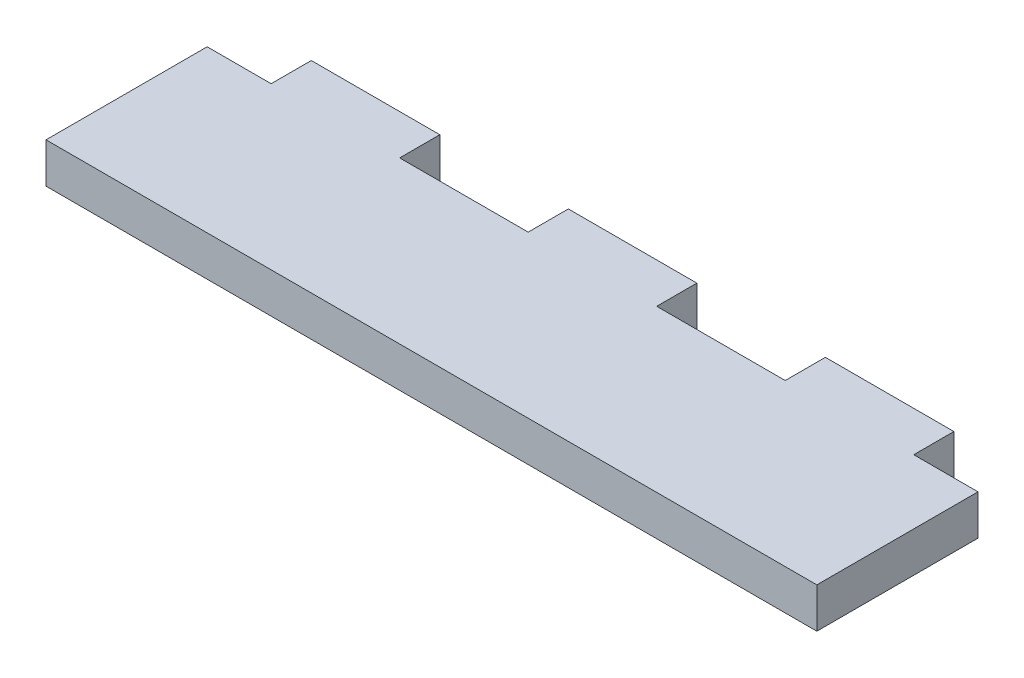
ISO-10303-21;
HEADER;
FILE_DESCRIPTION(('STEP AP214'),'2;1');
FILE_NAME('part.step','',(''),(''),'','','');
FILE_SCHEMA(('AUTOMOTIVE_DESIGN { 1 0 10303 214 1 1 1 1 }'));
ENDSEC;
DATA;
#1=APPLICATION_CONTEXT('core data for automotive mechanical design processes');
#2=APPLICATION_PROTOCOL_DEFINITION('international standard','automotive_design',2000,#1);
#3=PRODUCT_CONTEXT('',#1,'mechanical');
#4=PRODUCT('Part','Part','',(#3));
#5=PRODUCT_RELATED_PRODUCT_CATEGORY('part','',(#4));
#6=PRODUCT_DEFINITION_FORMATION('','',#4);
#7=PRODUCT_DEFINITION_CONTEXT('part definition',#1,'design');
#8=PRODUCT_DEFINITION('design','',#6,#7);
#9=PRODUCT_DEFINITION_SHAPE('','',#8);
#10=(LENGTH_UNIT() NAMED_UNIT(*) SI_UNIT(.MILLI.,.METRE.));
#11=(NAMED_UNIT(*) PLANE_ANGLE_UNIT() SI_UNIT($,.RADIAN.));
#12=(NAMED_UNIT(*) SI_UNIT($,.STERADIAN.) SOLID_ANGLE_UNIT());
#13=UNCERTAINTY_MEASURE_WITH_UNIT(LENGTH_MEASURE(1.E-05),#10,'distance_accuracy_value','');
#14=(GEOMETRIC_REPRESENTATION_CONTEXT(3) GLOBAL_UNCERTAINTY_ASSIGNED_CONTEXT((#13)) GLOBAL_UNIT_ASSIGNED_CONTEXT((#10,
#11,#12)) REPRESENTATION_CONTEXT('',''));
#15=CARTESIAN_POINT('',(0.,0.,0.));
#16=DIRECTION('',(0.,0.,1.));
#17=DIRECTION('',(1.,0.,0.));
#18=AXIS2_PLACEMENT_3D('',#15,#16,#17);
#19=CARTESIAN_POINT('',(0.,3.175,-41.275));
#20=DIRECTION('',(0.,0.,1.));
#21=DIRECTION('',(1.,0.,0.));
#22=AXIS2_PLACEMENT_3D('',#19,#20,#21);
#23=PLANE('',#22);
#24=DIRECTION('',(-1.,0.,0.));
#25=VECTOR('',#24,1.);
#26=CARTESIAN_POINT('',(0.,3.175,-41.275));
#27=LINE('',#26,#25);
#28=CARTESIAN_POINT('',(73.66,3.175,-41.275));
#29=VERTEX_POINT('',#28);
#30=CARTESIAN_POINT('',(68.5799999999997,3.175,-41.275));
#31=VERTEX_POINT('',#30);
#32=EDGE_CURVE('E365',#29,#31,#27,.T.);
#33=ORIENTED_EDGE('',*,*,#32,.F.);
#34=DIRECTION('',(0.,1.,0.));
#35=VECTOR('',#34,1.);
#36=CARTESIAN_POINT('',(73.66,0.,-41.275));
#37=LINE('',#36,#35);
#38=CARTESIAN_POINT('',(73.66,0.,-41.275));
#39=VERTEX_POINT('',#38);
#40=EDGE_CURVE('E244',#39,#29,#37,.T.);
#41=ORIENTED_EDGE('',*,*,#40,.F.);
#42=DIRECTION('',(-1.,0.,0.));
#43=VECTOR('',#42,1.);
#44=CARTESIAN_POINT('',(0.,0.,-41.275));
#45=LINE('',#44,#43);
#46=CARTESIAN_POINT('',(68.5799999999997,0.,-41.275));
#47=VERTEX_POINT('',#46);
#48=EDGE_CURVE('E378',#39,#47,#45,.T.);
#49=ORIENTED_EDGE('',*,*,#48,.T.);
#50=DIRECTION('',(0.,1.,0.));
#51=VECTOR('',#50,1.);
#52=CARTESIAN_POINT('',(68.5799999999997,3.175,-41.275));
#53=LINE('',#52,#51);
#54=EDGE_CURVE('E404',#47,#31,#53,.T.);
#55=ORIENTED_EDGE('',*,*,#54,.T.);
#56=EDGE_LOOP('',(#33,#41,#49,#55));
#57=FACE_BOUND('',#56,.T.);
#58=ADVANCED_FACE('F222',(#57),#23,.F.);
#59=CARTESIAN_POINT('',(58.4199999999997,3.175,-41.275));
#60=VERTEX_POINT('',#59);
#61=CARTESIAN_POINT('',(48.2599999999997,3.175,-41.275));
#62=VERTEX_POINT('',#61);
#63=EDGE_CURVE('E368',#60,#62,#27,.T.);
#64=ORIENTED_EDGE('',*,*,#63,.F.);
#65=DIRECTION('',(0.,-1.,0.));
#66=VECTOR('',#65,1.);
#67=CARTESIAN_POINT('',(58.4199999999997,3.175,-41.2750000000004));
#68=LINE('',#67,#66);
#69=CARTESIAN_POINT('',(58.4199999999997,0.,-41.275));
#70=VERTEX_POINT('',#69);
#71=EDGE_CURVE('E230',#60,#70,#68,.T.);
#72=ORIENTED_EDGE('',*,*,#71,.T.);
#73=CARTESIAN_POINT('',(48.2599999999997,0.,-41.275));
#74=VERTEX_POINT('',#73);
#75=EDGE_CURVE('E381',#70,#74,#45,.T.);
#76=ORIENTED_EDGE('',*,*,#75,.T.);
#77=DIRECTION('',(0.,1.,0.));
#78=VECTOR('',#77,1.);
#79=CARTESIAN_POINT('',(48.2599999999997,3.175,-41.275));
#80=LINE('',#79,#78);
#81=EDGE_CURVE('E401',#74,#62,#80,.T.);
#82=ORIENTED_EDGE('',*,*,#81,.T.);
#83=EDGE_LOOP('',(#64,#72,#76,#82));
#84=FACE_BOUND('',#83,.T.);
#85=ADVANCED_FACE('F491',(#84),#23,.F.);
#86=CARTESIAN_POINT('',(38.0999999999997,3.175,-41.275));
#87=VERTEX_POINT('',#86);
#88=CARTESIAN_POINT('',(27.9399999999997,3.175,-41.275));
#89=VERTEX_POINT('',#88);
#90=EDGE_CURVE('E369',#87,#89,#27,.T.);
#91=ORIENTED_EDGE('',*,*,#90,.F.);
#92=DIRECTION('',(0.,-1.,0.));
#93=VECTOR('',#92,1.);
#94=CARTESIAN_POINT('',(38.0999999999997,3.175,-41.275));
#95=LINE('',#94,#93);
#96=CARTESIAN_POINT('',(38.0999999999997,0.,-41.275));
#97=VERTEX_POINT('',#96);
#98=EDGE_CURVE('E403',#87,#97,#95,.T.);
#99=ORIENTED_EDGE('',*,*,#98,.T.);
#100=CARTESIAN_POINT('',(27.9399999999997,0.,-41.275));
#101=VERTEX_POINT('',#100);
#102=EDGE_CURVE('E382',#97,#101,#45,.T.);
#103=ORIENTED_EDGE('',*,*,#102,.T.);
#104=DIRECTION('',(0.,-1.,0.));
#105=VECTOR('',#104,1.);
#106=CARTESIAN_POINT('',(27.9399999999997,3.175,-41.275));
#107=LINE('',#106,#105);
#108=EDGE_CURVE('E398',#89,#101,#107,.T.);
#109=ORIENTED_EDGE('',*,*,#108,.F.);
#110=EDGE_LOOP('',(#91,#99,#103,#109));
#111=FACE_BOUND('',#110,.T.);
#112=ADVANCED_FACE('F452',(#111),#23,.F.);
#113=CARTESIAN_POINT('',(27.9399999999997,3.175,0.));
#114=DIRECTION('',(1.,0.,0.));
#115=DIRECTION('',(0.,0.,-1.));
#116=AXIS2_PLACEMENT_3D('',#113,#114,#115);
#117=PLANE('',#116);
#118=DIRECTION('',(0.,0.,1.));
#119=VECTOR('',#118,1.);
#120=CARTESIAN_POINT('',(27.9399999999997,0.,0.));
#121=LINE('',#120,#119);
#122=CARTESIAN_POINT('',(27.9399999999997,0.,-44.4499999999996));
#123=VERTEX_POINT('',#122);
#124=EDGE_CURVE('E380',#123,#101,#121,.T.);
#125=ORIENTED_EDGE('',*,*,#124,.F.);
#126=DIRECTION('',(0.,-1.,0.));
#127=VECTOR('',#126,1.);
#128=CARTESIAN_POINT('',(27.9399999999997,3.175,-44.4499999999996));
#129=LINE('',#128,#127);
#130=CARTESIAN_POINT('',(27.9399999999997,3.175,-44.4499999999996));
#131=VERTEX_POINT('',#130);
#132=EDGE_CURVE('E396',#131,#123,#129,.T.);
#133=ORIENTED_EDGE('',*,*,#132,.F.);
#134=DIRECTION('',(0.,0.,1.));
#135=VECTOR('',#134,1.);
#136=CARTESIAN_POINT('',(27.9399999999997,3.175,0.));
#137=LINE('',#136,#135);
#138=EDGE_CURVE('E367',#131,#89,#137,.T.);
#139=ORIENTED_EDGE('',*,*,#138,.T.);
#140=ORIENTED_EDGE('',*,*,#108,.T.);
#141=EDGE_LOOP('',(#125,#133,#139,#140));
#142=FACE_BOUND('',#141,.T.);
#143=ADVANCED_FACE('F482',(#142),#117,.T.);
#144=CARTESIAN_POINT('',(0.,3.175,-44.4499999999996));
#145=DIRECTION('',(0.,0.,-1.));
#146=DIRECTION('',(-1.,0.,0.));
#147=AXIS2_PLACEMENT_3D('',#144,#145,#146);
#148=PLANE('',#147);
#149=DIRECTION('',(1.,0.,0.));
#150=VECTOR('',#149,1.);
#151=CARTESIAN_POINT('',(0.,0.,-44.4499999999996));
#152=LINE('',#151,#150);
#153=CARTESIAN_POINT('',(17.7799999999997,0.,-44.4499999999996));
#154=VERTEX_POINT('',#153);
#155=EDGE_CURVE('E386',#154,#123,#152,.T.);
#156=ORIENTED_EDGE('',*,*,#155,.F.);
#157=DIRECTION('',(0.,-1.,0.));
#158=VECTOR('',#157,1.);
#159=CARTESIAN_POINT('',(17.7799999999997,3.175,-44.4499999999996));
#160=LINE('',#159,#158);
#161=CARTESIAN_POINT('',(17.7799999999997,3.175,-44.4499999999996));
#162=VERTEX_POINT('',#161);
#163=EDGE_CURVE('E394',#162,#154,#160,.T.);
#164=ORIENTED_EDGE('',*,*,#163,.F.);
#165=DIRECTION('',(1.,0.,0.));
#166=VECTOR('',#165,1.);
#167=CARTESIAN_POINT('',(0.,3.175,-44.4499999999996));
#168=LINE('',#167,#166);
#169=EDGE_CURVE('E373',#162,#131,#168,.T.);
#170=ORIENTED_EDGE('',*,*,#169,.T.);
#171=ORIENTED_EDGE('',*,*,#132,.T.);
#172=EDGE_LOOP('',(#156,#164,#170,#171));
#173=FACE_BOUND('',#172,.T.);
#174=ADVANCED_FACE('F480',(#173),#148,.T.);
#175=CARTESIAN_POINT('',(17.7799999999997,3.175,0.));
#176=DIRECTION('',(1.,0.,0.));
#177=DIRECTION('',(0.,0.,-1.));
#178=AXIS2_PLACEMENT_3D('',#175,#176,#177);
#179=PLANE('',#178);
#180=DIRECTION('',(0.,0.,1.));
#181=VECTOR('',#180,1.);
#182=CARTESIAN_POINT('',(17.7799999999997,0.,0.));
#183=LINE('',#182,#181);
#184=CARTESIAN_POINT('',(17.7799999999997,0.,-41.275));
#185=VERTEX_POINT('',#184);
#186=EDGE_CURVE('E389',#154,#185,#183,.T.);
#187=ORIENTED_EDGE('',*,*,#186,.T.);
#188=DIRECTION('',(0.,-1.,0.));
#189=VECTOR('',#188,1.);
#190=CARTESIAN_POINT('',(17.7799999999997,3.175,-41.275));
#191=LINE('',#190,#189);
#192=CARTESIAN_POINT('',(17.7799999999997,3.175,-41.275));
#193=VERTEX_POINT('',#192);
#194=EDGE_CURVE('E391',#193,#185,#191,.T.);
#195=ORIENTED_EDGE('',*,*,#194,.F.);
#196=DIRECTION('',(0.,0.,1.));
#197=VECTOR('',#196,1.);
#198=CARTESIAN_POINT('',(17.7799999999997,3.175,0.));
#199=LINE('',#198,#197);
#200=EDGE_CURVE('E376',#162,#193,#199,.T.);
#201=ORIENTED_EDGE('',*,*,#200,.F.);
#202=ORIENTED_EDGE('',*,*,#163,.T.);
#203=EDGE_LOOP('',(#187,#195,#201,#202));
#204=FACE_BOUND('',#203,.T.);
#205=ADVANCED_FACE('F489',(#204),#179,.F.);
#206=CARTESIAN_POINT('',(12.7224399567609,0.,-41.275));
#207=VERTEX_POINT('',#206);
#208=EDGE_CURVE('E383',#185,#207,#45,.T.);
#209=ORIENTED_EDGE('',*,*,#208,.T.);
#210=DIRECTION('',(0.,1.,0.));
#211=VECTOR('',#210,1.);
#212=CARTESIAN_POINT('',(12.7224399567609,3.175,-41.275));
#213=LINE('',#212,#211);
#214=CARTESIAN_POINT('',(12.7224399567609,3.175,-41.275));
#215=VERTEX_POINT('',#214);
#216=EDGE_CURVE('E340',#207,#215,#213,.T.);
#217=ORIENTED_EDGE('',*,*,#216,.T.);
#218=EDGE_CURVE('E370',#193,#215,#27,.T.);
#219=ORIENTED_EDGE('',*,*,#218,.F.);
#220=ORIENTED_EDGE('',*,*,#194,.T.);
#221=EDGE_LOOP('',(#209,#217,#219,#220));
#222=FACE_BOUND('',#221,.T.);
#223=ADVANCED_FACE('F475',(#222),#23,.F.);
#224=CARTESIAN_POINT('',(0.,0.,0.));
#225=DIRECTION('',(0.,1.,0.));
#226=DIRECTION('',(0.,0.,1.));
#227=AXIS2_PLACEMENT_3D('',#224,#225,#226);
#228=PLANE('',#227);
#229=DIRECTION('',(-1.,0.,0.));
#230=VECTOR('',#229,1.);
#231=CARTESIAN_POINT('',(12.7224399567609,0.,-28.5343203418336));
#232=LINE('',#231,#230);
#233=CARTESIAN_POINT('',(73.66,0.,-28.5343203418336));
#234=VERTEX_POINT('',#233);
#235=CARTESIAN_POINT('',(12.7224399567609,0.,-28.5343203418336));
#236=VERTEX_POINT('',#235);
#237=EDGE_CURVE('E237',#234,#236,#232,.T.);
#238=ORIENTED_EDGE('',*,*,#237,.T.);
#239=DIRECTION('',(0.,0.,-1.));
#240=VECTOR('',#239,1.);
#241=CARTESIAN_POINT('',(12.7224399567609,0.,-54.0070991574737));
#242=LINE('',#241,#240);
#243=EDGE_CURVE('E341',#236,#207,#242,.T.);
#244=ORIENTED_EDGE('',*,*,#243,.T.);
#245=ORIENTED_EDGE('',*,*,#208,.F.);
#246=ORIENTED_EDGE('',*,*,#186,.F.);
#247=ORIENTED_EDGE('',*,*,#155,.T.);
#248=ORIENTED_EDGE('',*,*,#124,.T.);
#249=ORIENTED_EDGE('',*,*,#102,.F.);
#250=DIRECTION('',(0.,0.,1.));
#251=VECTOR('',#250,1.);
#252=CARTESIAN_POINT('',(38.0999999999997,0.,-44.45));
#253=LINE('',#252,#251);
#254=CARTESIAN_POINT('',(38.0999999999997,0.,-44.45));
#255=VERTEX_POINT('',#254);
#256=EDGE_CURVE('E364',#255,#97,#253,.T.);
#257=ORIENTED_EDGE('',*,*,#256,.F.);
#258=DIRECTION('',(1.,0.,0.));
#259=VECTOR('',#258,1.);
#260=CARTESIAN_POINT('',(38.0999999999997,0.,-44.45));
#261=LINE('',#260,#259);
#262=CARTESIAN_POINT('',(48.2599999999997,0.,-44.45));
#263=VERTEX_POINT('',#262);
#264=EDGE_CURVE('E435',#255,#263,#261,.T.);
#265=ORIENTED_EDGE('',*,*,#264,.T.);
#266=DIRECTION('',(0.,0.,1.));
#267=VECTOR('',#266,1.);
#268=CARTESIAN_POINT('',(48.2599999999997,0.,-44.45));
#269=LINE('',#268,#267);
#270=EDGE_CURVE('E444',#263,#74,#269,.T.);
#271=ORIENTED_EDGE('',*,*,#270,.T.);
#272=ORIENTED_EDGE('',*,*,#75,.F.);
#273=DIRECTION('',(0.,0.,1.));
#274=VECTOR('',#273,1.);
#275=CARTESIAN_POINT('',(58.4199999999997,0.,-44.4500000000004));
#276=LINE('',#275,#274);
#277=CARTESIAN_POINT('',(58.4199999999997,0.,-44.4500000000004));
#278=VERTEX_POINT('',#277);
#279=EDGE_CURVE('E418',#278,#70,#276,.T.);
#280=ORIENTED_EDGE('',*,*,#279,.F.);
#281=DIRECTION('',(1.,0.,0.));
#282=VECTOR('',#281,1.);
#283=CARTESIAN_POINT('',(58.4199999999997,0.,-44.4500000000004));
#284=LINE('',#283,#282);
#285=CARTESIAN_POINT('',(68.5799999999997,0.,-44.4500000000004));
#286=VERTEX_POINT('',#285);
#287=EDGE_CURVE('E411',#278,#286,#284,.T.);
#288=ORIENTED_EDGE('',*,*,#287,.T.);
#289=DIRECTION('',(0.,0.,1.));
#290=VECTOR('',#289,1.);
#291=CARTESIAN_POINT('',(68.5799999999997,0.,-44.4500000000004));
#292=LINE('',#291,#290);
#293=EDGE_CURVE('E421',#286,#47,#292,.T.);
#294=ORIENTED_EDGE('',*,*,#293,.T.);
#295=ORIENTED_EDGE('',*,*,#48,.F.);
#296=DIRECTION('',(0.,0.,1.));
#297=VECTOR('',#296,1.);
#298=CARTESIAN_POINT('',(73.66,0.,-41.275));
#299=LINE('',#298,#297);
#300=EDGE_CURVE('E353',#39,#234,#299,.T.);
#301=ORIENTED_EDGE('',*,*,#300,.T.);
#302=EDGE_LOOP('',(#238,#244,#245,#246,#247,#248,#249,#257,#265,#271,#272,#280,#288,#294,#295,#301));
#303=FACE_BOUND('',#302,.T.);
#304=ADVANCED_FACE('F351',(#303),#228,.F.);
#305=CARTESIAN_POINT('',(0.,3.175,0.));
#306=DIRECTION('',(0.,1.,0.));
#307=DIRECTION('',(0.,0.,1.));
#308=AXIS2_PLACEMENT_3D('',#305,#306,#307);
#309=PLANE('',#308);
#310=DIRECTION('',(0.,0.,-1.));
#311=VECTOR('',#310,1.);
#312=CARTESIAN_POINT('',(12.7224399567609,3.175,-54.0070991574737));
#313=LINE('',#312,#311);
#314=CARTESIAN_POINT('',(12.7224399567609,3.175,-28.5343203418336));
#315=VERTEX_POINT('',#314);
#316=EDGE_CURVE('E354',#315,#215,#313,.T.);
#317=ORIENTED_EDGE('',*,*,#316,.F.);
#318=DIRECTION('',(-1.,0.,0.));
#319=VECTOR('',#318,1.);
#320=CARTESIAN_POINT('',(12.7224399567609,3.175,-28.5343203418336));
#321=LINE('',#320,#319);
#322=CARTESIAN_POINT('',(73.66,3.175,-28.5343203418336));
#323=VERTEX_POINT('',#322);
#324=EDGE_CURVE('E337',#323,#315,#321,.T.);
#325=ORIENTED_EDGE('',*,*,#324,.F.);
#326=DIRECTION('',(0.,0.,1.));
#327=VECTOR('',#326,1.);
#328=CARTESIAN_POINT('',(73.66,3.175,-41.275));
#329=LINE('',#328,#327);
#330=EDGE_CURVE('E360',#29,#323,#329,.T.);
#331=ORIENTED_EDGE('',*,*,#330,.F.);
#332=ORIENTED_EDGE('',*,*,#32,.T.);
#333=DIRECTION('',(0.,0.,1.));
#334=VECTOR('',#333,1.);
#335=CARTESIAN_POINT('',(68.5799999999997,3.175,-44.4500000000004));
#336=LINE('',#335,#334);
#337=CARTESIAN_POINT('',(68.5799999999997,3.175,-44.4500000000004));
#338=VERTEX_POINT('',#337);
#339=EDGE_CURVE('E410',#338,#31,#336,.T.);
#340=ORIENTED_EDGE('',*,*,#339,.F.);
#341=DIRECTION('',(1.,0.,0.));
#342=VECTOR('',#341,1.);
#343=CARTESIAN_POINT('',(58.4199999999997,3.175,-44.4500000000004));
#344=LINE('',#343,#342);
#345=CARTESIAN_POINT('',(58.4199999999997,3.175,-44.4500000000004));
#346=VERTEX_POINT('',#345);
#347=EDGE_CURVE('E414',#346,#338,#344,.T.);
#348=ORIENTED_EDGE('',*,*,#347,.F.);
#349=DIRECTION('',(0.,0.,1.));
#350=VECTOR('',#349,1.);
#351=CARTESIAN_POINT('',(58.4199999999997,3.175,-44.4500000000004));
#352=LINE('',#351,#350);
#353=EDGE_CURVE('E407',#346,#60,#352,.T.);
#354=ORIENTED_EDGE('',*,*,#353,.T.);
#355=ORIENTED_EDGE('',*,*,#63,.T.);
#356=DIRECTION('',(0.,0.,1.));
#357=VECTOR('',#356,1.);
#358=CARTESIAN_POINT('',(48.2599999999997,3.175,-44.45));
#359=LINE('',#358,#357);
#360=CARTESIAN_POINT('',(48.2599999999997,3.175,-44.45));
#361=VERTEX_POINT('',#360);
#362=EDGE_CURVE('E434',#361,#62,#359,.T.);
#363=ORIENTED_EDGE('',*,*,#362,.F.);
#364=DIRECTION('',(1.,0.,0.));
#365=VECTOR('',#364,1.);
#366=CARTESIAN_POINT('',(38.0999999999997,3.175,-44.45));
#367=LINE('',#366,#365);
#368=CARTESIAN_POINT('',(38.0999999999997,3.175,-44.45));
#369=VERTEX_POINT('',#368);
#370=EDGE_CURVE('E438',#369,#361,#367,.T.);
#371=ORIENTED_EDGE('',*,*,#370,.F.);
#372=DIRECTION('',(0.,0.,1.));
#373=VECTOR('',#372,1.);
#374=CARTESIAN_POINT('',(38.0999999999997,3.175,-44.45));
#375=LINE('',#374,#373);
#376=EDGE_CURVE('E431',#369,#87,#375,.T.);
#377=ORIENTED_EDGE('',*,*,#376,.T.);
#378=ORIENTED_EDGE('',*,*,#90,.T.);
#379=ORIENTED_EDGE('',*,*,#138,.F.);
#380=ORIENTED_EDGE('',*,*,#169,.F.);
#381=ORIENTED_EDGE('',*,*,#200,.T.);
#382=ORIENTED_EDGE('',*,*,#218,.T.);
#383=EDGE_LOOP('',(#317,#325,#331,#332,#340,#348,#354,#355,#363,#371,#377,#378,#379,#380,#381,#382));
#384=FACE_BOUND('',#383,.T.);
#385=ADVANCED_FACE('F471',(#384),#309,.T.);
#386=CARTESIAN_POINT('',(48.2599999999997,3.175,-44.45));
#387=DIRECTION('',(1.,0.,0.));
#388=DIRECTION('',(0.,0.,-1.));
#389=AXIS2_PLACEMENT_3D('',#386,#387,#388);
#390=PLANE('',#389);
#391=ORIENTED_EDGE('',*,*,#270,.F.);
#392=DIRECTION('',(0.,-1.,0.));
#393=VECTOR('',#392,1.);
#394=CARTESIAN_POINT('',(48.2599999999997,3.175,-44.45));
#395=LINE('',#394,#393);
#396=EDGE_CURVE('E422',#361,#263,#395,.T.);
#397=ORIENTED_EDGE('',*,*,#396,.F.);
#398=ORIENTED_EDGE('',*,*,#362,.T.);
#399=ORIENTED_EDGE('',*,*,#81,.F.);
#400=EDGE_LOOP('',(#391,#397,#398,#399));
#401=FACE_BOUND('',#400,.T.);
#402=ADVANCED_FACE('F497',(#401),#390,.T.);
#403=CARTESIAN_POINT('',(38.0999999999997,3.175,-44.45));
#404=DIRECTION('',(0.,0.,-1.));
#405=DIRECTION('',(-1.,0.,0.));
#406=AXIS2_PLACEMENT_3D('',#403,#404,#405);
#407=PLANE('',#406);
#408=ORIENTED_EDGE('',*,*,#264,.F.);
#409=DIRECTION('',(0.,-1.,0.));
#410=VECTOR('',#409,1.);
#411=CARTESIAN_POINT('',(38.0999999999997,3.175,-44.45));
#412=LINE('',#411,#410);
#413=EDGE_CURVE('E441',#369,#255,#412,.T.);
#414=ORIENTED_EDGE('',*,*,#413,.F.);
#415=ORIENTED_EDGE('',*,*,#370,.T.);
#416=ORIENTED_EDGE('',*,*,#396,.T.);
#417=EDGE_LOOP('',(#408,#414,#415,#416));
#418=FACE_BOUND('',#417,.T.);
#419=ADVANCED_FACE('F496',(#418),#407,.T.);
#420=CARTESIAN_POINT('',(38.0999999999997,3.175,-44.45));
#421=DIRECTION('',(1.,0.,0.));
#422=DIRECTION('',(0.,0.,-1.));
#423=AXIS2_PLACEMENT_3D('',#420,#421,#422);
#424=PLANE('',#423);
#425=ORIENTED_EDGE('',*,*,#256,.T.);
#426=ORIENTED_EDGE('',*,*,#98,.F.);
#427=ORIENTED_EDGE('',*,*,#376,.F.);
#428=ORIENTED_EDGE('',*,*,#413,.T.);
#429=EDGE_LOOP('',(#425,#426,#427,#428));
#430=FACE_BOUND('',#429,.T.);
#431=ADVANCED_FACE('F224',(#430),#424,.F.);
#432=CARTESIAN_POINT('',(68.5799999999997,3.175,-44.4500000000004));
#433=DIRECTION('',(1.,0.,0.));
#434=DIRECTION('',(0.,0.,-1.));
#435=AXIS2_PLACEMENT_3D('',#432,#433,#434);
#436=PLANE('',#435);
#437=ORIENTED_EDGE('',*,*,#293,.F.);
#438=DIRECTION('',(0.,-1.,0.));
#439=VECTOR('',#438,1.);
#440=CARTESIAN_POINT('',(68.5799999999997,3.175,-44.4500000000004));
#441=LINE('',#440,#439);
#442=EDGE_CURVE('E428',#338,#286,#441,.T.);
#443=ORIENTED_EDGE('',*,*,#442,.F.);
#444=ORIENTED_EDGE('',*,*,#339,.T.);
#445=ORIENTED_EDGE('',*,*,#54,.F.);
#446=EDGE_LOOP('',(#437,#443,#444,#445));
#447=FACE_BOUND('',#446,.T.);
#448=ADVANCED_FACE('F495',(#447),#436,.T.);
#449=CARTESIAN_POINT('',(58.4199999999997,3.175,-44.4500000000004));
#450=DIRECTION('',(0.,0.,-1.));
#451=DIRECTION('',(-1.,0.,0.));
#452=AXIS2_PLACEMENT_3D('',#449,#450,#451);
#453=PLANE('',#452);
#454=ORIENTED_EDGE('',*,*,#287,.F.);
#455=DIRECTION('',(0.,-1.,0.));
#456=VECTOR('',#455,1.);
#457=CARTESIAN_POINT('',(58.4199999999997,3.175,-44.4500000000004));
#458=LINE('',#457,#456);
#459=EDGE_CURVE('E417',#346,#278,#458,.T.);
#460=ORIENTED_EDGE('',*,*,#459,.F.);
#461=ORIENTED_EDGE('',*,*,#347,.T.);
#462=ORIENTED_EDGE('',*,*,#442,.T.);
#463=EDGE_LOOP('',(#454,#460,#461,#462));
#464=FACE_BOUND('',#463,.T.);
#465=ADVANCED_FACE('F502',(#464),#453,.T.);
#466=CARTESIAN_POINT('',(58.4199999999997,3.175,-44.4500000000004));
#467=DIRECTION('',(1.,0.,0.));
#468=DIRECTION('',(0.,0.,-1.));
#469=AXIS2_PLACEMENT_3D('',#466,#467,#468);
#470=PLANE('',#469);
#471=ORIENTED_EDGE('',*,*,#279,.T.);
#472=ORIENTED_EDGE('',*,*,#71,.F.);
#473=ORIENTED_EDGE('',*,*,#353,.F.);
#474=ORIENTED_EDGE('',*,*,#459,.T.);
#475=EDGE_LOOP('',(#471,#472,#473,#474));
#476=FACE_BOUND('',#475,.T.);
#477=ADVANCED_FACE('F505',(#476),#470,.F.);
#478=CARTESIAN_POINT('',(73.66,0.,-41.275));
#479=DIRECTION('',(-1.,0.,0.));
#480=DIRECTION('',(0.,0.,1.));
#481=AXIS2_PLACEMENT_3D('',#478,#479,#480);
#482=PLANE('',#481);
#483=ORIENTED_EDGE('',*,*,#330,.T.);
#484=DIRECTION('',(0.,-1.,0.));
#485=VECTOR('',#484,1.);
#486=CARTESIAN_POINT('',(73.66,0.,-28.5343203418336));
#487=LINE('',#486,#485);
#488=EDGE_CURVE('E12',#323,#234,#487,.T.);
#489=ORIENTED_EDGE('',*,*,#488,.T.);
#490=ORIENTED_EDGE('',*,*,#300,.F.);
#491=ORIENTED_EDGE('',*,*,#40,.T.);
#492=EDGE_LOOP('',(#483,#489,#490,#491));
#493=FACE_BOUND('',#492,.T.);
#494=ADVANCED_FACE('F517',(#493),#482,.F.);
#495=CARTESIAN_POINT('',(12.7224399567609,0.,-54.0070991574737));
#496=DIRECTION('',(1.,0.,0.));
#497=DIRECTION('',(0.,0.,-1.));
#498=AXIS2_PLACEMENT_3D('',#495,#496,#497);
#499=PLANE('',#498);
#500=ORIENTED_EDGE('',*,*,#243,.F.);
#501=DIRECTION('',(0.,1.,0.));
#502=VECTOR('',#501,1.);
#503=CARTESIAN_POINT('',(12.7224399567609,0.,-28.5343203418336));
#504=LINE('',#503,#502);
#505=EDGE_CURVE('E333',#236,#315,#504,.T.);
#506=ORIENTED_EDGE('',*,*,#505,.T.);
#507=ORIENTED_EDGE('',*,*,#316,.T.);
#508=ORIENTED_EDGE('',*,*,#216,.F.);
#509=EDGE_LOOP('',(#500,#506,#507,#508));
#510=FACE_BOUND('',#509,.T.);
#511=ADVANCED_FACE('F344',(#510),#499,.F.);
#512=CARTESIAN_POINT('',(12.7224399567609,0.,-28.5343203418336));
#513=DIRECTION('',(0.,0.,-1.));
#514=DIRECTION('',(-1.,0.,0.));
#515=AXIS2_PLACEMENT_3D('',#512,#513,#514);
#516=PLANE('',#515);
#517=ORIENTED_EDGE('',*,*,#324,.T.);
#518=ORIENTED_EDGE('',*,*,#505,.F.);
#519=ORIENTED_EDGE('',*,*,#237,.F.);
#520=ORIENTED_EDGE('',*,*,#488,.F.);
#521=EDGE_LOOP('',(#517,#518,#519,#520));
#522=FACE_BOUND('',#521,.T.);
#523=ADVANCED_FACE('F335',(#522),#516,.F.);
#524=CLOSED_SHELL('',(#58,#85,#112,#143,#174,#205,#223,#304,#385,#402,#419,#431,#448,#465,#477,
#494,#511,#523));
#525=MANIFOLD_SOLID_BREP('B2',#524);
#526=ADVANCED_BREP_SHAPE_REPRESENTATION('',(#18,#525),#14);
#527=SHAPE_DEFINITION_REPRESENTATION(#9,#526);
ENDSEC;
END-ISO-10303-21;
